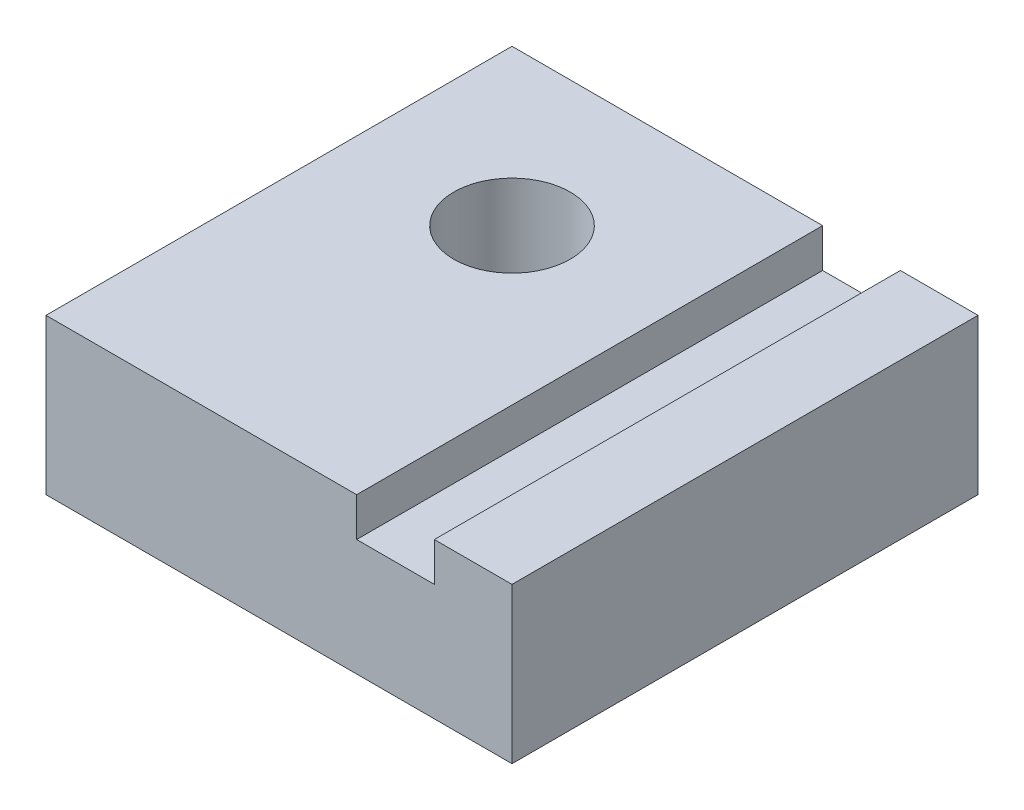
ISO-10303-21;
HEADER;
FILE_DESCRIPTION(('STEP AP214'),'2;1');
FILE_NAME('part.step','',(''),(''),'','','');
FILE_SCHEMA(('AUTOMOTIVE_DESIGN { 1 0 10303 214 1 1 1 1 }'));
ENDSEC;
DATA;
#1=APPLICATION_CONTEXT('core data for automotive mechanical design processes');
#2=APPLICATION_PROTOCOL_DEFINITION('international standard','automotive_design',2000,#1);
#3=PRODUCT_CONTEXT('',#1,'mechanical');
#4=PRODUCT('Part','Part','',(#3));
#5=PRODUCT_RELATED_PRODUCT_CATEGORY('part','',(#4));
#6=PRODUCT_DEFINITION_FORMATION('','',#4);
#7=PRODUCT_DEFINITION_CONTEXT('part definition',#1,'design');
#8=PRODUCT_DEFINITION('design','',#6,#7);
#9=PRODUCT_DEFINITION_SHAPE('','',#8);
#10=(LENGTH_UNIT() NAMED_UNIT(*) SI_UNIT(.MILLI.,.METRE.));
#11=(NAMED_UNIT(*) PLANE_ANGLE_UNIT() SI_UNIT($,.RADIAN.));
#12=(NAMED_UNIT(*) SI_UNIT($,.STERADIAN.) SOLID_ANGLE_UNIT());
#13=UNCERTAINTY_MEASURE_WITH_UNIT(LENGTH_MEASURE(1.E-05),#10,'distance_accuracy_value','');
#14=(GEOMETRIC_REPRESENTATION_CONTEXT(3) GLOBAL_UNCERTAINTY_ASSIGNED_CONTEXT((#13)) GLOBAL_UNIT_ASSIGNED_CONTEXT((#10,
#11,#12)) REPRESENTATION_CONTEXT('',''));
#15=CARTESIAN_POINT('',(0.,0.,0.));
#16=DIRECTION('',(0.,0.,1.));
#17=DIRECTION('',(1.,0.,0.));
#18=AXIS2_PLACEMENT_3D('',#15,#16,#17);
#19=CARTESIAN_POINT('',(-57.15,0.,76.2));
#20=DIRECTION('',(1.,0.,0.));
#21=DIRECTION('',(0.,0.,-1.));
#22=AXIS2_PLACEMENT_3D('',#19,#20,#21);
#23=PLANE('',#22);
#24=DIRECTION('',(0.,-1.,0.));
#25=VECTOR('',#24,1.);
#26=CARTESIAN_POINT('',(-57.15,0.,0.));
#27=LINE('',#26,#25);
#28=CARTESIAN_POINT('',(-57.15,25.4,0.));
#29=VERTEX_POINT('',#28);
#30=CARTESIAN_POINT('',(-57.15,0.,0.));
#31=VERTEX_POINT('',#30);
#32=EDGE_CURVE('E140',#29,#31,#27,.T.);
#33=ORIENTED_EDGE('',*,*,#32,.T.);
#34=DIRECTION('',(0.,0.,-1.));
#35=VECTOR('',#34,1.);
#36=CARTESIAN_POINT('',(-57.15,0.,76.2));
#37=LINE('',#36,#35);
#38=CARTESIAN_POINT('',(-57.15,0.,76.2));
#39=VERTEX_POINT('',#38);
#40=EDGE_CURVE('E13',#39,#31,#37,.T.);
#41=ORIENTED_EDGE('',*,*,#40,.F.);
#42=DIRECTION('',(0.,-1.,0.));
#43=VECTOR('',#42,1.);
#44=CARTESIAN_POINT('',(-57.15,0.,76.2));
#45=LINE('',#44,#43);
#46=CARTESIAN_POINT('',(-57.15,25.4,76.2));
#47=VERTEX_POINT('',#46);
#48=EDGE_CURVE('E155',#47,#39,#45,.T.);
#49=ORIENTED_EDGE('',*,*,#48,.F.);
#50=DIRECTION('',(0.,0.,-1.));
#51=VECTOR('',#50,1.);
#52=CARTESIAN_POINT('',(-57.15,25.4,76.2));
#53=LINE('',#52,#51);
#54=EDGE_CURVE('E136',#47,#29,#53,.T.);
#55=ORIENTED_EDGE('',*,*,#54,.T.);
#56=EDGE_LOOP('',(#33,#41,#49,#55));
#57=FACE_BOUND('',#56,.T.);
#58=ADVANCED_FACE('F44',(#57),#23,.F.);
#59=CARTESIAN_POINT('',(-57.15,0.,76.2));
#60=DIRECTION('',(0.,1.,0.));
#61=DIRECTION('',(0.,0.,1.));
#62=AXIS2_PLACEMENT_3D('',#59,#60,#61);
#63=PLANE('',#62);
#64=CARTESIAN_POINT('',(-31.75,0.,25.4));
#65=DIRECTION('',(0.,1.,0.));
#66=DIRECTION('',(0.,0.,1.));
#67=AXIS2_PLACEMENT_3D('',#64,#65,#66);
#68=CIRCLE('',#67,9.525);
#69=CARTESIAN_POINT('',(-31.75,0.,34.925));
#70=VERTEX_POINT('',#69);
#71=EDGE_CURVE('E144',#70,#70,#68,.T.);
#72=ORIENTED_EDGE('',*,*,#71,.T.);
#73=EDGE_LOOP('',(#72));
#74=FACE_BOUND('',#73,.T.);
#75=DIRECTION('',(1.,0.,0.));
#76=VECTOR('',#75,1.);
#77=CARTESIAN_POINT('',(-57.15,0.,0.));
#78=LINE('',#77,#76);
#79=CARTESIAN_POINT('',(19.05,0.,0.));
#80=VERTEX_POINT('',#79);
#81=EDGE_CURVE('E143',#31,#80,#78,.T.);
#82=ORIENTED_EDGE('',*,*,#81,.T.);
#83=DIRECTION('',(0.,0.,-1.));
#84=VECTOR('',#83,1.);
#85=CARTESIAN_POINT('',(19.05,0.,76.2));
#86=LINE('',#85,#84);
#87=CARTESIAN_POINT('',(19.05,0.,76.2));
#88=VERTEX_POINT('',#87);
#89=EDGE_CURVE('E52',#88,#80,#86,.T.);
#90=ORIENTED_EDGE('',*,*,#89,.F.);
#91=DIRECTION('',(1.,0.,0.));
#92=VECTOR('',#91,1.);
#93=CARTESIAN_POINT('',(-57.15,0.,76.2));
#94=LINE('',#93,#92);
#95=EDGE_CURVE('E103',#39,#88,#94,.T.);
#96=ORIENTED_EDGE('',*,*,#95,.F.);
#97=ORIENTED_EDGE('',*,*,#40,.T.);
#98=EDGE_LOOP('',(#82,#90,#96,#97));
#99=FACE_BOUND('',#98,.T.);
#100=ADVANCED_FACE('F194',(#74,#99),#63,.F.);
#101=CARTESIAN_POINT('',(19.05,25.4,76.2));
#102=DIRECTION('',(-1.,0.,0.));
#103=DIRECTION('',(0.,0.,1.));
#104=AXIS2_PLACEMENT_3D('',#101,#102,#103);
#105=PLANE('',#104);
#106=DIRECTION('',(0.,1.,0.));
#107=VECTOR('',#106,1.);
#108=CARTESIAN_POINT('',(19.05,25.4,0.));
#109=LINE('',#108,#107);
#110=CARTESIAN_POINT('',(19.05,25.4,0.));
#111=VERTEX_POINT('',#110);
#112=EDGE_CURVE('E146',#80,#111,#109,.T.);
#113=ORIENTED_EDGE('',*,*,#112,.T.);
#114=DIRECTION('',(0.,0.,-1.));
#115=VECTOR('',#114,1.);
#116=CARTESIAN_POINT('',(19.05,25.4,76.2));
#117=LINE('',#116,#115);
#118=CARTESIAN_POINT('',(19.05,25.4,76.2));
#119=VERTEX_POINT('',#118);
#120=EDGE_CURVE('E162',#119,#111,#117,.T.);
#121=ORIENTED_EDGE('',*,*,#120,.F.);
#122=DIRECTION('',(0.,1.,0.));
#123=VECTOR('',#122,1.);
#124=CARTESIAN_POINT('',(19.05,25.4,76.2));
#125=LINE('',#124,#123);
#126=EDGE_CURVE('E170',#88,#119,#125,.T.);
#127=ORIENTED_EDGE('',*,*,#126,.F.);
#128=ORIENTED_EDGE('',*,*,#89,.T.);
#129=EDGE_LOOP('',(#113,#121,#127,#128));
#130=FACE_BOUND('',#129,.T.);
#131=ADVANCED_FACE('F168',(#130),#105,.F.);
#132=CARTESIAN_POINT('',(6.35,25.4,76.2));
#133=DIRECTION('',(0.,-1.,0.));
#134=DIRECTION('',(1.,0.,0.));
#135=AXIS2_PLACEMENT_3D('',#132,#133,#134);
#136=PLANE('',#135);
#137=DIRECTION('',(-1.,0.,0.));
#138=VECTOR('',#137,1.);
#139=CARTESIAN_POINT('',(6.35,25.4,0.));
#140=LINE('',#139,#138);
#141=CARTESIAN_POINT('',(6.35,25.4,0.));
#142=VERTEX_POINT('',#141);
#143=EDGE_CURVE('E148',#111,#142,#140,.T.);
#144=ORIENTED_EDGE('',*,*,#143,.T.);
#145=DIRECTION('',(0.,0.,-1.));
#146=VECTOR('',#145,1.);
#147=CARTESIAN_POINT('',(6.35,25.4,76.2));
#148=LINE('',#147,#146);
#149=CARTESIAN_POINT('',(6.35,25.4,76.2));
#150=VERTEX_POINT('',#149);
#151=EDGE_CURVE('E159',#150,#142,#148,.T.);
#152=ORIENTED_EDGE('',*,*,#151,.F.);
#153=DIRECTION('',(-1.,0.,0.));
#154=VECTOR('',#153,1.);
#155=CARTESIAN_POINT('',(6.35,25.4,76.2));
#156=LINE('',#155,#154);
#157=EDGE_CURVE('E182',#119,#150,#156,.T.);
#158=ORIENTED_EDGE('',*,*,#157,.F.);
#159=ORIENTED_EDGE('',*,*,#120,.T.);
#160=EDGE_LOOP('',(#144,#152,#158,#159));
#161=FACE_BOUND('',#160,.T.);
#162=ADVANCED_FACE('F178',(#161),#136,.F.);
#163=CARTESIAN_POINT('',(6.35,19.05,76.2));
#164=DIRECTION('',(1.,0.,0.));
#165=DIRECTION('',(0.,1.,0.));
#166=AXIS2_PLACEMENT_3D('',#163,#164,#165);
#167=PLANE('',#166);
#168=DIRECTION('',(0.,-1.,0.));
#169=VECTOR('',#168,1.);
#170=CARTESIAN_POINT('',(6.35,19.05,0.));
#171=LINE('',#170,#169);
#172=CARTESIAN_POINT('',(6.35,19.05,0.));
#173=VERTEX_POINT('',#172);
#174=EDGE_CURVE('E150',#142,#173,#171,.T.);
#175=ORIENTED_EDGE('',*,*,#174,.T.);
#176=DIRECTION('',(0.,0.,-1.));
#177=VECTOR('',#176,1.);
#178=CARTESIAN_POINT('',(6.35,19.05,76.2));
#179=LINE('',#178,#177);
#180=CARTESIAN_POINT('',(6.35,19.05,76.2));
#181=VERTEX_POINT('',#180);
#182=EDGE_CURVE('E131',#181,#173,#179,.T.);
#183=ORIENTED_EDGE('',*,*,#182,.F.);
#184=DIRECTION('',(0.,-1.,0.));
#185=VECTOR('',#184,1.);
#186=CARTESIAN_POINT('',(6.35,19.05,76.2));
#187=LINE('',#186,#185);
#188=EDGE_CURVE('E122',#150,#181,#187,.T.);
#189=ORIENTED_EDGE('',*,*,#188,.F.);
#190=ORIENTED_EDGE('',*,*,#151,.T.);
#191=EDGE_LOOP('',(#175,#183,#189,#190));
#192=FACE_BOUND('',#191,.T.);
#193=ADVANCED_FACE('F181',(#192),#167,.F.);
#194=CARTESIAN_POINT('',(-6.35,19.05,76.2));
#195=DIRECTION('',(0.,-1.,0.));
#196=DIRECTION('',(1.,0.,0.));
#197=AXIS2_PLACEMENT_3D('',#194,#195,#196);
#198=PLANE('',#197);
#199=DIRECTION('',(-1.,0.,0.));
#200=VECTOR('',#199,1.);
#201=CARTESIAN_POINT('',(-6.35,19.05,0.));
#202=LINE('',#201,#200);
#203=CARTESIAN_POINT('',(-6.35,19.05,0.));
#204=VERTEX_POINT('',#203);
#205=EDGE_CURVE('E130',#173,#204,#202,.T.);
#206=ORIENTED_EDGE('',*,*,#205,.T.);
#207=DIRECTION('',(0.,0.,-1.));
#208=VECTOR('',#207,1.);
#209=CARTESIAN_POINT('',(-6.35,19.05,76.2));
#210=LINE('',#209,#208);
#211=CARTESIAN_POINT('',(-6.35,19.05,76.2));
#212=VERTEX_POINT('',#211);
#213=EDGE_CURVE('E127',#212,#204,#210,.T.);
#214=ORIENTED_EDGE('',*,*,#213,.F.);
#215=DIRECTION('',(-1.,0.,0.));
#216=VECTOR('',#215,1.);
#217=CARTESIAN_POINT('',(-6.35,19.05,76.2));
#218=LINE('',#217,#216);
#219=EDGE_CURVE('E116',#181,#212,#218,.T.);
#220=ORIENTED_EDGE('',*,*,#219,.F.);
#221=ORIENTED_EDGE('',*,*,#182,.T.);
#222=EDGE_LOOP('',(#206,#214,#220,#221));
#223=FACE_BOUND('',#222,.T.);
#224=ADVANCED_FACE('F128',(#223),#198,.F.);
#225=CARTESIAN_POINT('',(-6.35,25.4,76.2));
#226=DIRECTION('',(-1.,0.,0.));
#227=DIRECTION('',(0.,-1.,0.));
#228=AXIS2_PLACEMENT_3D('',#225,#226,#227);
#229=PLANE('',#228);
#230=DIRECTION('',(0.,1.,0.));
#231=VECTOR('',#230,1.);
#232=CARTESIAN_POINT('',(-6.35,25.4,0.));
#233=LINE('',#232,#231);
#234=CARTESIAN_POINT('',(-6.35,25.4,0.));
#235=VERTEX_POINT('',#234);
#236=EDGE_CURVE('E89',#204,#235,#233,.T.);
#237=ORIENTED_EDGE('',*,*,#236,.T.);
#238=DIRECTION('',(0.,0.,-1.));
#239=VECTOR('',#238,1.);
#240=CARTESIAN_POINT('',(-6.35,25.4,76.2));
#241=LINE('',#240,#239);
#242=CARTESIAN_POINT('',(-6.35,25.4,76.2));
#243=VERTEX_POINT('',#242);
#244=EDGE_CURVE('E132',#243,#235,#241,.T.);
#245=ORIENTED_EDGE('',*,*,#244,.F.);
#246=DIRECTION('',(0.,1.,0.));
#247=VECTOR('',#246,1.);
#248=CARTESIAN_POINT('',(-6.35,25.4,76.2));
#249=LINE('',#248,#247);
#250=EDGE_CURVE('E120',#212,#243,#249,.T.);
#251=ORIENTED_EDGE('',*,*,#250,.F.);
#252=ORIENTED_EDGE('',*,*,#213,.T.);
#253=EDGE_LOOP('',(#237,#245,#251,#252));
#254=FACE_BOUND('',#253,.T.);
#255=ADVANCED_FACE('F134',(#254),#229,.F.);
#256=CARTESIAN_POINT('',(-57.15,25.4,76.2));
#257=DIRECTION('',(0.,-1.,0.));
#258=DIRECTION('',(0.,0.,-1.));
#259=AXIS2_PLACEMENT_3D('',#256,#257,#258);
#260=PLANE('',#259);
#261=CARTESIAN_POINT('',(-31.75,25.4,25.4));
#262=DIRECTION('',(0.,1.,0.));
#263=DIRECTION('',(0.,0.,1.));
#264=AXIS2_PLACEMENT_3D('',#261,#262,#263);
#265=CIRCLE('',#264,9.525);
#266=CARTESIAN_POINT('',(-31.75,25.4,34.925));
#267=VERTEX_POINT('',#266);
#268=EDGE_CURVE('E188',#267,#267,#265,.T.);
#269=ORIENTED_EDGE('',*,*,#268,.F.);
#270=EDGE_LOOP('',(#269));
#271=FACE_BOUND('',#270,.T.);
#272=DIRECTION('',(-1.,0.,0.));
#273=VECTOR('',#272,1.);
#274=CARTESIAN_POINT('',(-57.15,25.4,0.));
#275=LINE('',#274,#273);
#276=EDGE_CURVE('E95',#235,#29,#275,.T.);
#277=ORIENTED_EDGE('',*,*,#276,.T.);
#278=ORIENTED_EDGE('',*,*,#54,.F.);
#279=DIRECTION('',(-1.,0.,0.));
#280=VECTOR('',#279,1.);
#281=CARTESIAN_POINT('',(-57.15,25.4,76.2));
#282=LINE('',#281,#280);
#283=EDGE_CURVE('E60',#243,#47,#282,.T.);
#284=ORIENTED_EDGE('',*,*,#283,.F.);
#285=ORIENTED_EDGE('',*,*,#244,.T.);
#286=EDGE_LOOP('',(#277,#278,#284,#285));
#287=FACE_BOUND('',#286,.T.);
#288=ADVANCED_FACE('F202',(#271,#287),#260,.F.);
#289=CARTESIAN_POINT('',(0.,0.,76.2));
#290=DIRECTION('',(0.,0.,-1.));
#291=DIRECTION('',(-1.,0.,0.));
#292=AXIS2_PLACEMENT_3D('',#289,#290,#291);
#293=PLANE('',#292);
#294=ORIENTED_EDGE('',*,*,#48,.T.);
#295=ORIENTED_EDGE('',*,*,#95,.T.);
#296=ORIENTED_EDGE('',*,*,#126,.T.);
#297=ORIENTED_EDGE('',*,*,#157,.T.);
#298=ORIENTED_EDGE('',*,*,#188,.T.);
#299=ORIENTED_EDGE('',*,*,#219,.T.);
#300=ORIENTED_EDGE('',*,*,#250,.T.);
#301=ORIENTED_EDGE('',*,*,#283,.T.);
#302=EDGE_LOOP('',(#294,#295,#296,#297,#298,#299,#300,#301));
#303=FACE_BOUND('',#302,.T.);
#304=ADVANCED_FACE('F118',(#303),#293,.F.);
#305=CARTESIAN_POINT('',(0.,0.,0.));
#306=DIRECTION('',(0.,0.,-1.));
#307=DIRECTION('',(-1.,0.,0.));
#308=AXIS2_PLACEMENT_3D('',#305,#306,#307);
#309=PLANE('',#308);
#310=ORIENTED_EDGE('',*,*,#32,.F.);
#311=ORIENTED_EDGE('',*,*,#276,.F.);
#312=ORIENTED_EDGE('',*,*,#236,.F.);
#313=ORIENTED_EDGE('',*,*,#205,.F.);
#314=ORIENTED_EDGE('',*,*,#174,.F.);
#315=ORIENTED_EDGE('',*,*,#143,.F.);
#316=ORIENTED_EDGE('',*,*,#112,.F.);
#317=ORIENTED_EDGE('',*,*,#81,.F.);
#318=EDGE_LOOP('',(#310,#311,#312,#313,#314,#315,#316,#317));
#319=FACE_BOUND('',#318,.T.);
#320=ADVANCED_FACE('F174',(#319),#309,.T.);
#321=CARTESIAN_POINT('',(-31.75,0.,25.4));
#322=DIRECTION('',(0.,1.,0.));
#323=DIRECTION('',(0.,0.,1.));
#324=AXIS2_PLACEMENT_3D('',#321,#322,#323);
#325=CYLINDRICAL_SURFACE('',#324,9.525);
#326=CARTESIAN_POINT('',(-31.75,0.,34.925));
#327=CARTESIAN_POINT('',(-31.75,0.264583333333333,34.925));
#328=CARTESIAN_POINT('',(-31.75,0.529166666666667,34.925));
#329=CARTESIAN_POINT('',(-31.75,1.05833333333333,34.925));
#330=CARTESIAN_POINT('',(-31.75,1.32291666666667,34.925));
#331=CARTESIAN_POINT('',(-31.75,1.85208333333333,34.925));
#332=CARTESIAN_POINT('',(-31.75,2.11666666666667,34.925));
#333=CARTESIAN_POINT('',(-31.75,2.64583333333333,34.925));
#334=CARTESIAN_POINT('',(-31.75,2.91041666666667,34.925));
#335=CARTESIAN_POINT('',(-31.75,3.43958333333333,34.925));
#336=CARTESIAN_POINT('',(-31.75,3.70416666666667,34.925));
#337=CARTESIAN_POINT('',(-31.75,4.23333333333333,34.925));
#338=CARTESIAN_POINT('',(-31.75,4.49791666666667,34.925));
#339=CARTESIAN_POINT('',(-31.75,5.02708333333333,34.925));
#340=CARTESIAN_POINT('',(-31.75,5.29166666666667,34.925));
#341=CARTESIAN_POINT('',(-31.75,5.82083333333333,34.925));
#342=CARTESIAN_POINT('',(-31.75,6.08541666666667,34.925));
#343=CARTESIAN_POINT('',(-31.75,6.61458333333333,34.925));
#344=CARTESIAN_POINT('',(-31.75,6.87916666666667,34.925));
#345=CARTESIAN_POINT('',(-31.75,7.40833333333333,34.925));
#346=CARTESIAN_POINT('',(-31.75,7.67291666666667,34.925));
#347=CARTESIAN_POINT('',(-31.75,8.20208333333333,34.925));
#348=CARTESIAN_POINT('',(-31.75,8.46666666666667,34.925));
#349=CARTESIAN_POINT('',(-31.75,8.99583333333334,34.925));
#350=CARTESIAN_POINT('',(-31.75,9.26041666666667,34.925));
#351=CARTESIAN_POINT('',(-31.75,9.78958333333333,34.925));
#352=CARTESIAN_POINT('',(-31.75,10.0541666666667,34.925));
#353=CARTESIAN_POINT('',(-31.75,10.5833333333333,34.925));
#354=CARTESIAN_POINT('',(-31.75,10.8479166666667,34.925));
#355=CARTESIAN_POINT('',(-31.75,11.3770833333333,34.925));
#356=CARTESIAN_POINT('',(-31.75,11.6416666666667,34.925));
#357=CARTESIAN_POINT('',(-31.75,12.1708333333333,34.925));
#358=CARTESIAN_POINT('',(-31.75,12.4354166666667,34.925));
#359=CARTESIAN_POINT('',(-31.75,12.9645833333333,34.925));
#360=CARTESIAN_POINT('',(-31.75,13.2291666666667,34.925));
#361=CARTESIAN_POINT('',(-31.75,13.7583333333333,34.925));
#362=CARTESIAN_POINT('',(-31.75,14.0229166666667,34.925));
#363=CARTESIAN_POINT('',(-31.75,14.5520833333333,34.925));
#364=CARTESIAN_POINT('',(-31.75,14.8166666666667,34.925));
#365=CARTESIAN_POINT('',(-31.75,15.3458333333333,34.925));
#366=CARTESIAN_POINT('',(-31.75,15.6104166666667,34.925));
#367=CARTESIAN_POINT('',(-31.75,16.1395833333333,34.925));
#368=CARTESIAN_POINT('',(-31.75,16.4041666666667,34.925));
#369=CARTESIAN_POINT('',(-31.75,16.9333333333333,34.925));
#370=CARTESIAN_POINT('',(-31.75,17.1979166666667,34.925));
#371=CARTESIAN_POINT('',(-31.75,17.7270833333333,34.925));
#372=CARTESIAN_POINT('',(-31.75,17.9916666666667,34.925));
#373=CARTESIAN_POINT('',(-31.75,18.5208333333333,34.925));
#374=CARTESIAN_POINT('',(-31.75,18.7854166666667,34.925));
#375=CARTESIAN_POINT('',(-31.75,19.3145833333333,34.925));
#376=CARTESIAN_POINT('',(-31.75,19.5791666666667,34.925));
#377=CARTESIAN_POINT('',(-31.75,20.1083333333333,34.925));
#378=CARTESIAN_POINT('',(-31.75,20.3729166666667,34.925));
#379=CARTESIAN_POINT('',(-31.75,20.9020833333333,34.925));
#380=CARTESIAN_POINT('',(-31.75,21.1666666666667,34.925));
#381=CARTESIAN_POINT('',(-31.75,21.6958333333333,34.925));
#382=CARTESIAN_POINT('',(-31.75,21.9604166666667,34.925));
#383=CARTESIAN_POINT('',(-31.75,22.4895833333333,34.925));
#384=CARTESIAN_POINT('',(-31.75,22.7541666666667,34.925));
#385=CARTESIAN_POINT('',(-31.75,23.2833333333333,34.925));
#386=CARTESIAN_POINT('',(-31.75,23.5479166666667,34.925));
#387=CARTESIAN_POINT('',(-31.75,24.0770833333333,34.925));
#388=CARTESIAN_POINT('',(-31.75,24.3416666666667,34.925));
#389=CARTESIAN_POINT('',(-31.75,24.8708333333333,34.925));
#390=CARTESIAN_POINT('',(-31.75,25.1354166666667,34.925));
#391=CARTESIAN_POINT('',(-31.75,25.4,34.925));
#392=B_SPLINE_CURVE_WITH_KNOTS('',3,(#326,#327,#328,#329,#330,#331,#332,#333,#334,#335,#336,
#337,#338,#339,#340,#341,#342,#343,#344,#345,#346,#347,#348,#349,#350,#351,#352,#353,#354,#355,
#356,#357,#358,#359,#360,#361,#362,#363,#364,#365,#366,#367,#368,#369,#370,#371,#372,#373,#374,
#375,#376,#377,#378,#379,#380,#381,#382,#383,#384,#385,#386,#387,#388,#389,#390,#391),
.UNSPECIFIED.,.F.,.F.,(4,2,2,2,2,2,2,2,2,2,2,2,2,2,2,2,2,2,2,2,2,2,2,2,2,2,2,2,2,2,2,2,4),(0.,
0.79375,1.5875,2.38125,3.175,3.96875,4.7625,5.55625,6.35,7.14375,7.9375,8.73125,9.525,10.31875,
11.1125,11.90625,12.7,13.49375,14.2875,15.08125,15.875,16.66875,17.4625,18.25625,19.05,19.84375,
20.6375,21.43125,22.225,23.01875,23.8125,24.60625,25.4),.UNSPECIFIED.);
#393=EDGE_CURVE('BSEAM196',#70,#267,#392,.T.);
#394=ORIENTED_EDGE('',*,*,#71,.F.);
#395=ORIENTED_EDGE('',*,*,#268,.T.);
#396=ORIENTED_EDGE('',*,*,#393,.T.);
#397=ORIENTED_EDGE('',*,*,#393,.F.);
#398=EDGE_LOOP('',(#394,#396,#395,#397));
#399=FACE_BOUND('',#398,.T.);
#400=ADVANCED_FACE('F196',(#399),#325,.F.);
#401=CLOSED_SHELL('',(#58,#100,#131,#162,#193,#224,#255,#288,#304,#320,#400));
#402=MANIFOLD_SOLID_BREP('B2',#401);
#403=ADVANCED_BREP_SHAPE_REPRESENTATION('',(#18,#402),#14);
#404=SHAPE_DEFINITION_REPRESENTATION(#9,#403);
ENDSEC;
END-ISO-10303-21;
